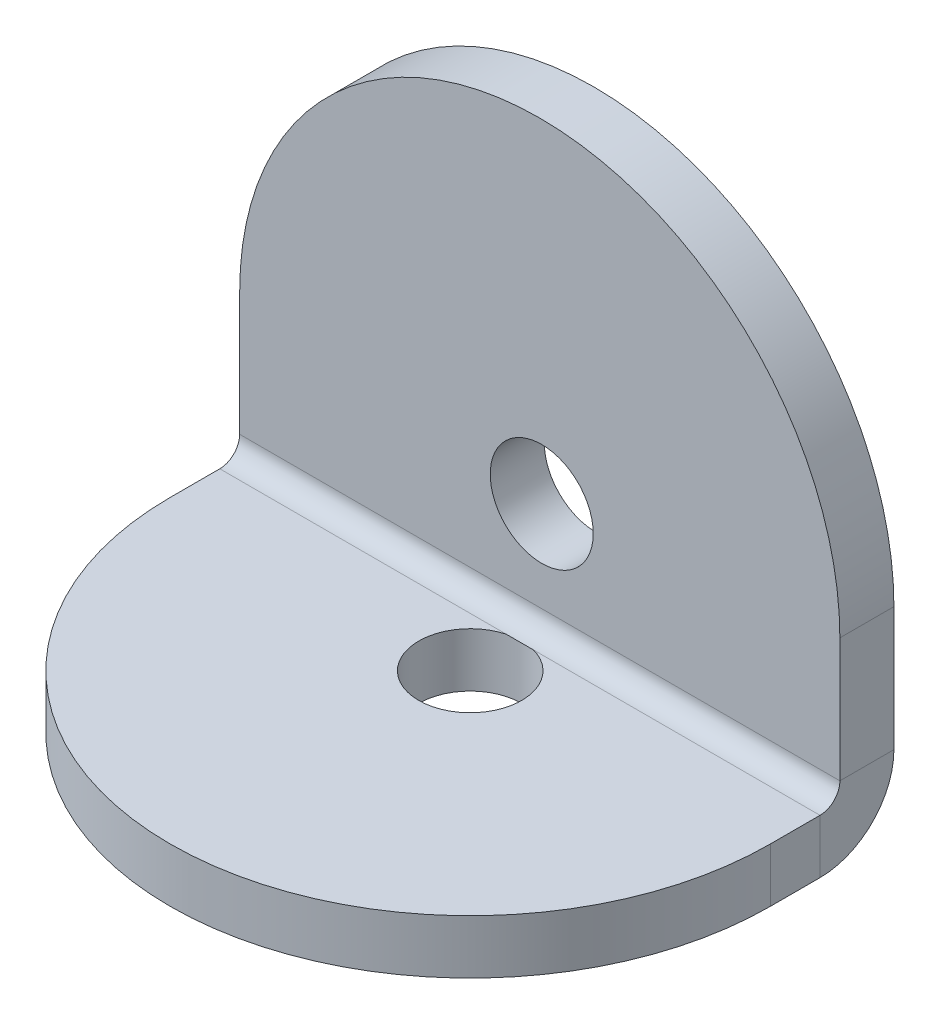
ISO-10303-21;
HEADER;
FILE_DESCRIPTION(('STEP AP214'),'2;1');
FILE_NAME('part.step','',(''),(''),'','','');
FILE_SCHEMA(('AUTOMOTIVE_DESIGN { 1 0 10303 214 1 1 1 1 }'));
ENDSEC;
DATA;
#1=APPLICATION_CONTEXT('core data for automotive mechanical design processes');
#2=APPLICATION_PROTOCOL_DEFINITION('international standard','automotive_design',2000,#1);
#3=PRODUCT_CONTEXT('',#1,'mechanical');
#4=PRODUCT('Part','Part','',(#3));
#5=PRODUCT_RELATED_PRODUCT_CATEGORY('part','',(#4));
#6=PRODUCT_DEFINITION_FORMATION('','',#4);
#7=PRODUCT_DEFINITION_CONTEXT('part definition',#1,'design');
#8=PRODUCT_DEFINITION('design','',#6,#7);
#9=PRODUCT_DEFINITION_SHAPE('','',#8);
#10=(LENGTH_UNIT() NAMED_UNIT(*) SI_UNIT(.MILLI.,.METRE.));
#11=(NAMED_UNIT(*) PLANE_ANGLE_UNIT() SI_UNIT($,.RADIAN.));
#12=(NAMED_UNIT(*) SI_UNIT($,.STERADIAN.) SOLID_ANGLE_UNIT());
#13=UNCERTAINTY_MEASURE_WITH_UNIT(LENGTH_MEASURE(1.E-05),#10,'distance_accuracy_value','');
#14=(GEOMETRIC_REPRESENTATION_CONTEXT(3) GLOBAL_UNCERTAINTY_ASSIGNED_CONTEXT((#13)) GLOBAL_UNIT_ASSIGNED_CONTEXT((#10,
#11,#12)) REPRESENTATION_CONTEXT('',''));
#15=CARTESIAN_POINT('',(0.,0.,0.));
#16=DIRECTION('',(0.,0.,1.));
#17=DIRECTION('',(1.,0.,0.));
#18=AXIS2_PLACEMENT_3D('',#15,#16,#17);
#19=CARTESIAN_POINT('',(3.92546538608496,5.31713620501463,1.99898000000001));
#20=DIRECTION('',(0.,0.,-1.));
#21=DIRECTION('',(0.,1.,0.));
#22=AXIS2_PLACEMENT_3D('',#19,#20,#21);
#23=PLANE('',#22);
#24=CARTESIAN_POINT('',(3.99776200283,4.09330652,1.99897999999999));
#25=DIRECTION('',(0.,0.,1.));
#26=DIRECTION('',(1.,0.,0.));
#27=AXIS2_PLACEMENT_3D('',#24,#25,#26);
#28=CIRCLE('',#27,1.905);
#29=CARTESIAN_POINT('',(5.90276200283,4.09330652,1.99897999999999));
#30=VERTEX_POINT('',#29);
#31=EDGE_CURVE('E297',#30,#30,#28,.T.);
#32=ORIENTED_EDGE('',*,*,#31,.F.);
#33=EDGE_LOOP('',(#32));
#34=FACE_BOUND('',#33,.T.);
#35=DIRECTION('',(0.,-1.,0.));
#36=VECTOR('',#35,1.);
#37=CARTESIAN_POINT('',(-7.17537007988709,-3.82686379498537,1.99897999999997));
#38=LINE('',#37,#36);
#39=CARTESIAN_POINT('',(-7.17537007988709,5.31713620501463,1.99898000000001));
#40=VERTEX_POINT('',#39);
#41=CARTESIAN_POINT('',(-7.17537007988709,0.736600000000002,1.99897999999999));
#42=VERTEX_POINT('',#41);
#43=EDGE_CURVE('E166',#40,#42,#38,.T.);
#44=ORIENTED_EDGE('',*,*,#43,.T.);
#45=DIRECTION('',(1.,0.,0.));
#46=VECTOR('',#45,1.);
#47=CARTESIAN_POINT('',(3.92546538608496,0.736600000000002,1.99897999999999));
#48=LINE('',#47,#46);
#49=CARTESIAN_POINT('',(15.026300852057,0.736600000000002,1.99897999999999));
#50=VERTEX_POINT('',#49);
#51=EDGE_CURVE('E179',#42,#50,#48,.T.);
#52=ORIENTED_EDGE('',*,*,#51,.T.);
#53=DIRECTION('',(0.,1.,0.));
#54=VECTOR('',#53,1.);
#55=CARTESIAN_POINT('',(15.026300852057,-3.82686379498537,1.99897999999997));
#56=LINE('',#55,#54);
#57=CARTESIAN_POINT('',(15.026300852057,5.31713620501463,1.99898000000001));
#58=VERTEX_POINT('',#57);
#59=EDGE_CURVE('E162',#50,#58,#56,.T.);
#60=ORIENTED_EDGE('',*,*,#59,.T.);
#61=CARTESIAN_POINT('',(3.92546538608496,5.31713620501463,1.99898000000001));
#62=DIRECTION('',(0.,0.,1.));
#63=DIRECTION('',(0.,1.,0.));
#64=AXIS2_PLACEMENT_3D('',#61,#62,#63);
#65=CIRCLE('',#64,11.100835465972);
#66=EDGE_CURVE('E163',#58,#40,#65,.T.);
#67=ORIENTED_EDGE('',*,*,#66,.T.);
#68=EDGE_LOOP('',(#44,#52,#60,#67));
#69=FACE_BOUND('',#68,.T.);
#70=ADVANCED_FACE('F48',(#34,#69),#23,.F.);
#71=CARTESIAN_POINT('',(3.92546538608496,5.31713620501464,0.));
#72=DIRECTION('',(0.,0.,1.));
#73=DIRECTION('',(0.,-1.,0.));
#74=AXIS2_PLACEMENT_3D('',#71,#72,#73);
#75=CYLINDRICAL_SURFACE('',#74,11.100835465972);
#76=ORIENTED_EDGE('',*,*,#66,.F.);
#77=DIRECTION('',(0.,0.,1.));
#78=VECTOR('',#77,1.);
#79=CARTESIAN_POINT('',(15.026300852057,5.31713620501464,0.));
#80=LINE('',#79,#78);
#81=CARTESIAN_POINT('',(15.026300852057,5.31713620501464,0.));
#82=VERTEX_POINT('',#81);
#83=EDGE_CURVE('E168',#82,#58,#80,.T.);
#84=ORIENTED_EDGE('',*,*,#83,.F.);
#85=CARTESIAN_POINT('',(3.92546538608496,5.31713620501464,0.));
#86=DIRECTION('',(0.,0.,1.));
#87=DIRECTION('',(0.,1.,0.));
#88=AXIS2_PLACEMENT_3D('',#85,#86,#87);
#89=CIRCLE('',#88,11.100835465972);
#90=CARTESIAN_POINT('',(-7.17537007988709,5.31713620501464,0.));
#91=VERTEX_POINT('',#90);
#92=EDGE_CURVE('E158',#82,#91,#89,.T.);
#93=ORIENTED_EDGE('',*,*,#92,.T.);
#94=DIRECTION('',(0.,0.,1.));
#95=VECTOR('',#94,1.);
#96=CARTESIAN_POINT('',(-7.17537007988709,5.31713620501464,0.));
#97=LINE('',#96,#95);
#98=EDGE_CURVE('E172',#91,#40,#97,.T.);
#99=ORIENTED_EDGE('',*,*,#98,.T.);
#100=EDGE_LOOP('',(#76,#84,#93,#99));
#101=FACE_BOUND('',#100,.T.);
#102=ADVANCED_FACE('F209',(#101),#75,.T.);
#103=CARTESIAN_POINT('',(15.026300852057,-3.82686379498536,0.));
#104=DIRECTION('',(1.,0.,0.));
#105=DIRECTION('',(0.,1.,0.));
#106=AXIS2_PLACEMENT_3D('',#103,#104,#105);
#107=PLANE('',#106);
#108=DIRECTION('',(0.,0.,1.));
#109=VECTOR('',#108,1.);
#110=CARTESIAN_POINT('',(15.026300852057,0.736600000000009,0.));
#111=LINE('',#110,#109);
#112=CARTESIAN_POINT('',(15.026300852057,0.736600000000012,0.));
#113=VERTEX_POINT('',#112);
#114=EDGE_CURVE('E176',#113,#50,#111,.T.);
#115=ORIENTED_EDGE('',*,*,#114,.F.);
#116=DIRECTION('',(0.,1.,0.));
#117=VECTOR('',#116,1.);
#118=CARTESIAN_POINT('',(15.026300852057,-3.82686379498536,0.));
#119=LINE('',#118,#117);
#120=EDGE_CURVE('E174',#113,#82,#119,.T.);
#121=ORIENTED_EDGE('',*,*,#120,.T.);
#122=ORIENTED_EDGE('',*,*,#83,.T.);
#123=ORIENTED_EDGE('',*,*,#59,.F.);
#124=EDGE_LOOP('',(#115,#121,#122,#123));
#125=FACE_BOUND('',#124,.T.);
#126=ADVANCED_FACE('F215',(#125),#107,.T.);
#127=CARTESIAN_POINT('',(-7.17537007988709,-3.82686379498536,0.));
#128=DIRECTION('',(-1.,0.,0.));
#129=DIRECTION('',(0.,-1.,0.));
#130=AXIS2_PLACEMENT_3D('',#127,#128,#129);
#131=PLANE('',#130);
#132=DIRECTION('',(0.,0.,-1.));
#133=VECTOR('',#132,1.);
#134=CARTESIAN_POINT('',(-7.17537007988709,0.736600000000009,0.));
#135=LINE('',#134,#133);
#136=CARTESIAN_POINT('',(-7.17537007988709,0.736600000000009,0.));
#137=VERTEX_POINT('',#136);
#138=EDGE_CURVE('E57',#42,#137,#135,.T.);
#139=ORIENTED_EDGE('',*,*,#138,.F.);
#140=ORIENTED_EDGE('',*,*,#43,.F.);
#141=ORIENTED_EDGE('',*,*,#98,.F.);
#142=DIRECTION('',(0.,-1.,0.));
#143=VECTOR('',#142,1.);
#144=CARTESIAN_POINT('',(-7.17537007988709,-3.82686379498536,0.));
#145=LINE('',#144,#143);
#146=EDGE_CURVE('E161',#91,#137,#145,.T.);
#147=ORIENTED_EDGE('',*,*,#146,.T.);
#148=EDGE_LOOP('',(#139,#140,#141,#147));
#149=FACE_BOUND('',#148,.T.);
#150=ADVANCED_FACE('F50',(#149),#131,.T.);
#151=CARTESIAN_POINT('',(3.92546538608496,5.31713620501464,0.));
#152=DIRECTION('',(0.,0.,-1.));
#153=DIRECTION('',(0.,1.,0.));
#154=AXIS2_PLACEMENT_3D('',#151,#152,#153);
#155=PLANE('',#154);
#156=CARTESIAN_POINT('',(3.99776200283,4.09330652,0.));
#157=DIRECTION('',(0.,0.,-1.));
#158=DIRECTION('',(0.,1.,0.));
#159=AXIS2_PLACEMENT_3D('',#156,#157,#158);
#160=CIRCLE('',#159,1.905);
#161=CARTESIAN_POINT('',(3.99776200283,5.99830652,0.));
#162=VERTEX_POINT('',#161);
#163=EDGE_CURVE('E52',#162,#162,#160,.T.);
#164=ORIENTED_EDGE('',*,*,#163,.F.);
#165=EDGE_LOOP('',(#164));
#166=FACE_BOUND('',#165,.T.);
#167=DIRECTION('',(1.,0.,0.));
#168=VECTOR('',#167,1.);
#169=CARTESIAN_POINT('',(3.92546538608496,0.736600000000009,0.));
#170=LINE('',#169,#168);
#171=EDGE_CURVE('E171',#137,#113,#170,.T.);
#172=ORIENTED_EDGE('',*,*,#171,.F.);
#173=ORIENTED_EDGE('',*,*,#146,.F.);
#174=ORIENTED_EDGE('',*,*,#92,.F.);
#175=ORIENTED_EDGE('',*,*,#120,.F.);
#176=EDGE_LOOP('',(#172,#173,#174,#175));
#177=FACE_BOUND('',#176,.T.);
#178=ADVANCED_FACE('F224',(#166,#177),#155,.T.);
#179=CARTESIAN_POINT('',(3.92546538608496,-1.99898,4.572));
#180=DIRECTION('',(0.,1.,0.));
#181=DIRECTION('',(0.,0.,1.));
#182=AXIS2_PLACEMENT_3D('',#179,#180,#181);
#183=CYLINDRICAL_SURFACE('',#182,11.100835465972);
#184=CARTESIAN_POINT('',(3.92546538608496,0.,4.572));
#185=DIRECTION('',(0.,1.,0.));
#186=DIRECTION('',(0.,0.,1.));
#187=AXIS2_PLACEMENT_3D('',#184,#185,#186);
#188=CIRCLE('',#187,11.100835465972);
#189=CARTESIAN_POINT('',(-7.17537007988709,0.,4.572));
#190=VERTEX_POINT('',#189);
#191=CARTESIAN_POINT('',(15.026300852057,0.,4.572));
#192=VERTEX_POINT('',#191);
#193=EDGE_CURVE('E281',#190,#192,#188,.T.);
#194=ORIENTED_EDGE('',*,*,#193,.F.);
#195=DIRECTION('',(0.,1.,0.));
#196=VECTOR('',#195,1.);
#197=CARTESIAN_POINT('',(-7.17537007988709,-1.99898,4.572));
#198=LINE('',#197,#196);
#199=CARTESIAN_POINT('',(-7.17537007988709,-1.99898,4.572));
#200=VERTEX_POINT('',#199);
#201=EDGE_CURVE('E167',#200,#190,#198,.T.);
#202=ORIENTED_EDGE('',*,*,#201,.F.);
#203=CARTESIAN_POINT('',(3.92546538608496,-1.99898,4.572));
#204=DIRECTION('',(0.,1.,0.));
#205=DIRECTION('',(0.,0.,1.));
#206=AXIS2_PLACEMENT_3D('',#203,#204,#205);
#207=CIRCLE('',#206,11.100835465972);
#208=CARTESIAN_POINT('',(15.026300852057,-1.99898,4.572));
#209=VERTEX_POINT('',#208);
#210=EDGE_CURVE('E146',#200,#209,#207,.T.);
#211=ORIENTED_EDGE('',*,*,#210,.T.);
#212=DIRECTION('',(0.,1.,0.));
#213=VECTOR('',#212,1.);
#214=CARTESIAN_POINT('',(15.026300852057,-1.99898,4.572));
#215=LINE('',#214,#213);
#216=EDGE_CURVE('E143',#209,#192,#215,.T.);
#217=ORIENTED_EDGE('',*,*,#216,.T.);
#218=EDGE_LOOP('',(#194,#202,#211,#217));
#219=FACE_BOUND('',#218,.T.);
#220=ADVANCED_FACE('F225',(#219),#183,.T.);
#221=CARTESIAN_POINT('',(3.92546538608496,-1.99898,-4.572));
#222=DIRECTION('',(0.,-1.,0.));
#223=DIRECTION('',(0.,0.,-1.));
#224=AXIS2_PLACEMENT_3D('',#221,#222,#223);
#225=PLANE('',#224);
#226=CARTESIAN_POINT('',(3.92546538608496,-1.99898,4.572));
#227=DIRECTION('',(0.,1.,0.));
#228=DIRECTION('',(0.,0.,1.));
#229=AXIS2_PLACEMENT_3D('',#226,#227,#228);
#230=CIRCLE('',#229,1.90500000000001);
#231=CARTESIAN_POINT('',(3.41892162331612,-1.99898,2.73557999999999));
#232=VERTEX_POINT('',#231);
#233=CARTESIAN_POINT('',(4.43200914885381,-1.99898,2.73557999999999));
#234=VERTEX_POINT('',#233);
#235=EDGE_CURVE('E69',#232,#234,#230,.T.);
#236=ORIENTED_EDGE('',*,*,#235,.T.);
#237=DIRECTION('',(1.,0.,0.));
#238=VECTOR('',#237,1.);
#239=CARTESIAN_POINT('',(3.92546538608496,-1.99898,2.73557999999999));
#240=LINE('',#239,#238);
#241=CARTESIAN_POINT('',(15.026300852057,-1.99898,2.73557999999999));
#242=VERTEX_POINT('',#241);
#243=EDGE_CURVE('E131',#234,#242,#240,.T.);
#244=ORIENTED_EDGE('',*,*,#243,.T.);
#245=DIRECTION('',(0.,0.,-1.));
#246=VECTOR('',#245,1.);
#247=CARTESIAN_POINT('',(15.026300852057,-1.99898,4.572));
#248=LINE('',#247,#246);
#249=EDGE_CURVE('E145',#209,#242,#248,.T.);
#250=ORIENTED_EDGE('',*,*,#249,.F.);
#251=ORIENTED_EDGE('',*,*,#210,.F.);
#252=DIRECTION('',(0.,0.,1.));
#253=VECTOR('',#252,1.);
#254=CARTESIAN_POINT('',(-7.17537007988709,-1.99898,4.572));
#255=LINE('',#254,#253);
#256=CARTESIAN_POINT('',(-7.17537007988709,-1.99898,2.73557999999999));
#257=VERTEX_POINT('',#256);
#258=EDGE_CURVE('E274',#257,#200,#255,.T.);
#259=ORIENTED_EDGE('',*,*,#258,.F.);
#260=EDGE_CURVE('E134',#257,#232,#240,.T.);
#261=ORIENTED_EDGE('',*,*,#260,.T.);
#262=EDGE_LOOP('',(#236,#244,#250,#251,#259,#261));
#263=FACE_BOUND('',#262,.T.);
#264=ADVANCED_FACE('F129',(#263),#225,.T.);
#265=CARTESIAN_POINT('',(15.026300852057,-1.99898,4.572));
#266=DIRECTION('',(1.,0.,0.));
#267=DIRECTION('',(0.,0.,-1.));
#268=AXIS2_PLACEMENT_3D('',#265,#266,#267);
#269=PLANE('',#268);
#270=ORIENTED_EDGE('',*,*,#249,.T.);
#271=DIRECTION('',(0.,1.,0.));
#272=VECTOR('',#271,1.);
#273=CARTESIAN_POINT('',(15.026300852057,-1.99898,2.73557999999999));
#274=LINE('',#273,#272);
#275=CARTESIAN_POINT('',(15.026300852057,0.,2.73557999999999));
#276=VERTEX_POINT('',#275);
#277=EDGE_CURVE('E285',#242,#276,#274,.T.);
#278=ORIENTED_EDGE('',*,*,#277,.T.);
#279=DIRECTION('',(0.,0.,-1.));
#280=VECTOR('',#279,1.);
#281=CARTESIAN_POINT('',(15.026300852057,0.,4.572));
#282=LINE('',#281,#280);
#283=EDGE_CURVE('E279',#192,#276,#282,.T.);
#284=ORIENTED_EDGE('',*,*,#283,.F.);
#285=ORIENTED_EDGE('',*,*,#216,.F.);
#286=EDGE_LOOP('',(#270,#278,#284,#285));
#287=FACE_BOUND('',#286,.T.);
#288=ADVANCED_FACE('F236',(#287),#269,.T.);
#289=CARTESIAN_POINT('',(3.92546538608496,0.,-4.572));
#290=DIRECTION('',(0.,-1.,0.));
#291=DIRECTION('',(0.,0.,-1.));
#292=AXIS2_PLACEMENT_3D('',#289,#290,#291);
#293=PLANE('',#292);
#294=DIRECTION('',(1.,0.,0.));
#295=VECTOR('',#294,1.);
#296=CARTESIAN_POINT('',(3.92546538608496,0.,2.73557999999999));
#297=LINE('',#296,#295);
#298=CARTESIAN_POINT('',(4.43200914885381,0.,2.73557999999999));
#299=VERTEX_POINT('',#298);
#300=EDGE_CURVE('E157',#299,#276,#297,.T.);
#301=ORIENTED_EDGE('',*,*,#300,.F.);
#302=CARTESIAN_POINT('',(3.92546538608496,0.,4.572));
#303=DIRECTION('',(0.,1.,0.));
#304=DIRECTION('',(0.,0.,1.));
#305=AXIS2_PLACEMENT_3D('',#302,#303,#304);
#306=CIRCLE('',#305,1.90500000000001);
#307=CARTESIAN_POINT('',(3.41892162331612,0.,2.73557999999999));
#308=VERTEX_POINT('',#307);
#309=EDGE_CURVE('E294',#308,#299,#306,.T.);
#310=ORIENTED_EDGE('',*,*,#309,.F.);
#311=CARTESIAN_POINT('',(-7.17537007988709,0.,2.73557999999999));
#312=VERTEX_POINT('',#311);
#313=EDGE_CURVE('E153',#312,#308,#297,.T.);
#314=ORIENTED_EDGE('',*,*,#313,.F.);
#315=DIRECTION('',(0.,0.,1.));
#316=VECTOR('',#315,1.);
#317=CARTESIAN_POINT('',(-7.17537007988709,0.,4.572));
#318=LINE('',#317,#316);
#319=EDGE_CURVE('E284',#312,#190,#318,.T.);
#320=ORIENTED_EDGE('',*,*,#319,.T.);
#321=ORIENTED_EDGE('',*,*,#193,.T.);
#322=ORIENTED_EDGE('',*,*,#283,.T.);
#323=EDGE_LOOP('',(#301,#310,#314,#320,#321,#322));
#324=FACE_BOUND('',#323,.T.);
#325=ADVANCED_FACE('F232',(#324),#293,.F.);
#326=CARTESIAN_POINT('',(-7.17537007988709,-1.99898,4.572));
#327=DIRECTION('',(-1.,0.,0.));
#328=DIRECTION('',(0.,0.,1.));
#329=AXIS2_PLACEMENT_3D('',#326,#327,#328);
#330=PLANE('',#329);
#331=ORIENTED_EDGE('',*,*,#319,.F.);
#332=DIRECTION('',(0.,-1.,0.));
#333=VECTOR('',#332,1.);
#334=CARTESIAN_POINT('',(-7.17537007988709,-1.99898,2.73557999999999));
#335=LINE('',#334,#333);
#336=EDGE_CURVE('E276',#312,#257,#335,.T.);
#337=ORIENTED_EDGE('',*,*,#336,.T.);
#338=ORIENTED_EDGE('',*,*,#258,.T.);
#339=ORIENTED_EDGE('',*,*,#201,.T.);
#340=EDGE_LOOP('',(#331,#337,#338,#339));
#341=FACE_BOUND('',#340,.T.);
#342=ADVANCED_FACE('F228',(#341),#330,.T.);
#343=CARTESIAN_POINT('',(-7.17537007988709,0.7366,2.73557999999999));
#344=DIRECTION('',(-1.,0.,0.));
#345=DIRECTION('',(0.,0.,1.));
#346=AXIS2_PLACEMENT_3D('',#343,#344,#345);
#347=PLANE('',#346);
#348=ORIENTED_EDGE('',*,*,#336,.F.);
#349=CARTESIAN_POINT('',(-7.17537007988709,0.7366,2.73557999999999));
#350=DIRECTION('',(1.,0.,0.));
#351=DIRECTION('',(0.,0.,-1.));
#352=AXIS2_PLACEMENT_3D('',#349,#350,#351);
#353=CIRCLE('',#352,0.7366);
#354=EDGE_CURVE('E135',#312,#42,#353,.T.);
#355=ORIENTED_EDGE('',*,*,#354,.T.);
#356=ORIENTED_EDGE('',*,*,#138,.T.);
#357=CARTESIAN_POINT('',(-7.17537007988709,0.7366,2.73557999999999));
#358=DIRECTION('',(1.,0.,0.));
#359=DIRECTION('',(0.,0.,1.));
#360=AXIS2_PLACEMENT_3D('',#357,#358,#359);
#361=CIRCLE('',#360,2.73558);
#362=EDGE_CURVE('E265',#257,#137,#361,.T.);
#363=ORIENTED_EDGE('',*,*,#362,.F.);
#364=EDGE_LOOP('',(#348,#355,#356,#363));
#365=FACE_BOUND('',#364,.T.);
#366=ADVANCED_FACE('F231',(#365),#347,.T.);
#367=CARTESIAN_POINT('',(15.026300852057,0.7366,2.73557999999999));
#368=DIRECTION('',(1.,0.,0.));
#369=DIRECTION('',(0.,0.,-1.));
#370=AXIS2_PLACEMENT_3D('',#367,#368,#369);
#371=PLANE('',#370);
#372=ORIENTED_EDGE('',*,*,#114,.T.);
#373=CARTESIAN_POINT('',(15.026300852057,0.7366,2.73557999999999));
#374=DIRECTION('',(1.,0.,0.));
#375=DIRECTION('',(0.,0.,-1.));
#376=AXIS2_PLACEMENT_3D('',#373,#374,#375);
#377=CIRCLE('',#376,0.7366);
#378=EDGE_CURVE('E257',#50,#276,#377,.F.);
#379=ORIENTED_EDGE('',*,*,#378,.T.);
#380=ORIENTED_EDGE('',*,*,#277,.F.);
#381=CARTESIAN_POINT('',(15.026300852057,0.7366,2.73557999999999));
#382=DIRECTION('',(-1.,0.,0.));
#383=DIRECTION('',(0.,0.,-1.));
#384=AXIS2_PLACEMENT_3D('',#381,#382,#383);
#385=CIRCLE('',#384,2.73558);
#386=EDGE_CURVE('E141',#113,#242,#385,.T.);
#387=ORIENTED_EDGE('',*,*,#386,.F.);
#388=EDGE_LOOP('',(#372,#379,#380,#387));
#389=FACE_BOUND('',#388,.T.);
#390=ADVANCED_FACE('F248',(#389),#371,.T.);
#391=CARTESIAN_POINT('',(-18.5322032611834,0.7366,2.73557999999999));
#392=DIRECTION('',(1.,0.,0.));
#393=DIRECTION('',(0.,0.,-1.));
#394=AXIS2_PLACEMENT_3D('',#391,#392,#393);
#395=CYLINDRICAL_SURFACE('',#394,2.73558);
#396=CARTESIAN_POINT('',(3.41892162331612,-1.99898,2.73557999999999));
#397=CARTESIAN_POINT('',(3.47112249821124,-1.99896845512165,2.7211751513365));
#398=CARTESIAN_POINT('',(3.52393969732947,-1.99886576281347,2.70900764319146));
#399=CARTESIAN_POINT('',(3.63043099980151,-1.99860794471496,2.68920751794595));
#400=CARTESIAN_POINT('',(3.68410531277897,-1.99845280590475,2.68157602821402));
#401=CARTESIAN_POINT('',(3.79071658553733,-1.99822266459124,2.67103326502034));
#402=CARTESIAN_POINT('',(3.84364359656815,-1.99814596553975,2.66802132389139));
#403=CARTESIAN_POINT('',(3.94954295346339,-1.99810544534912,2.66641628593249));
#404=CARTESIAN_POINT('',(4.00251527545486,-1.99814158265168,2.66782156221615));
#405=CARTESIAN_POINT('',(4.11854950177491,-1.99833093183259,2.67575286887791));
#406=CARTESIAN_POINT('',(4.18154829194798,-1.99850575674902,2.68323100984206));
#407=CARTESIAN_POINT('',(4.30733521853485,-1.99881891745598,2.70455848068414));
#408=CARTESIAN_POINT('',(4.37010898534434,-1.99895672782821,2.71849260141119));
#409=CARTESIAN_POINT('',(4.43200914885381,-1.99898,2.73557999999999));
#410=B_SPLINE_CURVE_WITH_KNOTS('',3,(#396,#397,#398,#399,#400,#401,#402,#403,#404,#405,#406,
#407,#408,#409),.UNSPECIFIED.,.F.,.F.,(4,2,2,2,2,2,4),(0.,0.162405419622806,0.324851186146983,
0.483704003386443,0.642498321083208,0.832500702675278,1.02507251112902),.UNSPECIFIED.);
#411=EDGE_CURVE('E12',#232,#234,#410,.T.);
#412=ORIENTED_EDGE('',*,*,#411,.F.);
#413=ORIENTED_EDGE('',*,*,#260,.F.);
#414=ORIENTED_EDGE('',*,*,#362,.T.);
#415=ORIENTED_EDGE('',*,*,#171,.T.);
#416=ORIENTED_EDGE('',*,*,#386,.T.);
#417=ORIENTED_EDGE('',*,*,#243,.F.);
#418=EDGE_LOOP('',(#412,#413,#414,#415,#416,#417));
#419=FACE_BOUND('',#418,.T.);
#420=ADVANCED_FACE('F138',(#419),#395,.T.);
#421=CARTESIAN_POINT('',(-18.5322032611834,0.7366,2.73557999999999));
#422=DIRECTION('',(1.,0.,0.));
#423=DIRECTION('',(0.,0.,-1.));
#424=AXIS2_PLACEMENT_3D('',#421,#422,#423);
#425=CYLINDRICAL_SURFACE('',#424,0.7366);
#426=ORIENTED_EDGE('',*,*,#378,.F.);
#427=ORIENTED_EDGE('',*,*,#51,.F.);
#428=ORIENTED_EDGE('',*,*,#354,.F.);
#429=ORIENTED_EDGE('',*,*,#313,.T.);
#430=EDGE_CURVE('E156',#308,#299,#297,.T.);
#431=ORIENTED_EDGE('',*,*,#430,.T.);
#432=ORIENTED_EDGE('',*,*,#300,.T.);
#433=EDGE_LOOP('',(#426,#427,#428,#429,#431,#432));
#434=FACE_BOUND('',#433,.T.);
#435=ADVANCED_FACE('F203',(#434),#425,.F.);
#436=CARTESIAN_POINT('',(5.83046538608498,0.,4.572));
#437=DIRECTION('',(0.,1.,0.));
#438=DIRECTION('',(0.,0.,1.));
#439=AXIS2_PLACEMENT_3D('',#436,#437,#438);
#440=PLANE('',#439);
#441=ORIENTED_EDGE('',*,*,#430,.F.);
#442=EDGE_CURVE('E63',#299,#308,#306,.T.);
#443=ORIENTED_EDGE('',*,*,#442,.F.);
#444=EDGE_LOOP('',(#441,#443));
#445=FACE_BOUND('',#444,.T.);
#446=ADVANCED_FACE('F201',(#445),#440,.F.);
#447=CARTESIAN_POINT('',(3.92546538608496,0.,4.572));
#448=DIRECTION('',(0.,1.,0.));
#449=DIRECTION('',(0.,0.,1.));
#450=AXIS2_PLACEMENT_3D('',#447,#448,#449);
#451=CYLINDRICAL_SURFACE('',#450,1.90500000000001);
#452=ORIENTED_EDGE('',*,*,#411,.T.);
#453=ORIENTED_EDGE('',*,*,#235,.F.);
#454=EDGE_LOOP('',(#452,#453));
#455=FACE_BOUND('',#454,.T.);
#456=ORIENTED_EDGE('',*,*,#442,.T.);
#457=ORIENTED_EDGE('',*,*,#309,.T.);
#458=EDGE_LOOP('',(#456,#457));
#459=FACE_BOUND('',#458,.T.);
#460=ADVANCED_FACE('F122',(#455,#459),#451,.F.);
#461=CARTESIAN_POINT('',(3.99776200283,4.09330652,-0.541020000000012));
#462=DIRECTION('',(0.,0.,1.));
#463=DIRECTION('',(1.,0.,0.));
#464=AXIS2_PLACEMENT_3D('',#461,#462,#463);
#465=CYLINDRICAL_SURFACE('',#464,1.905);
#466=ORIENTED_EDGE('',*,*,#163,.T.);
#467=EDGE_LOOP('',(#466));
#468=FACE_BOUND('',#467,.T.);
#469=ORIENTED_EDGE('',*,*,#31,.T.);
#470=EDGE_LOOP('',(#469));
#471=FACE_BOUND('',#470,.T.);
#472=ADVANCED_FACE('F200',(#468,#471),#465,.F.);
#473=CLOSED_SHELL('',(#70,#102,#126,#150,#178,#220,#264,#288,#325,#342,#366,#390,#420,#435,#446,
#460,#472));
#474=MANIFOLD_SOLID_BREP('B2',#473);
#475=ADVANCED_BREP_SHAPE_REPRESENTATION('',(#18,#474),#14);
#476=SHAPE_DEFINITION_REPRESENTATION(#9,#475);
ENDSEC;
END-ISO-10303-21;
